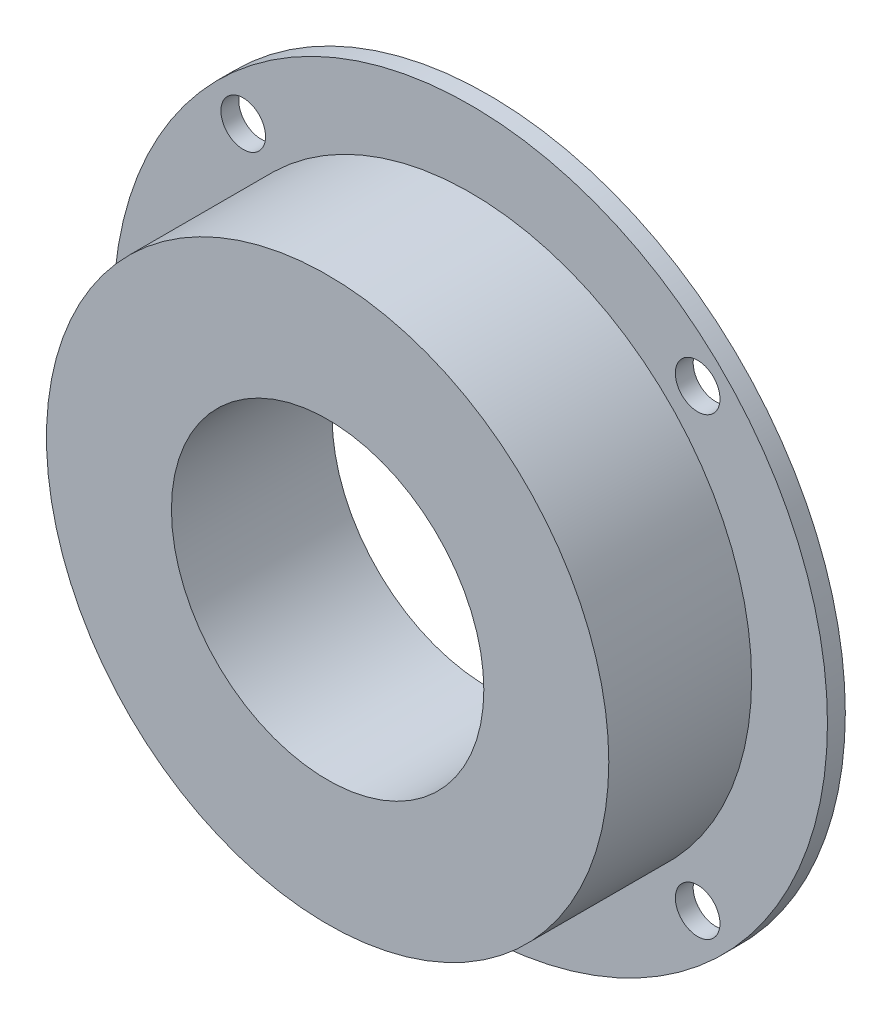
ISO-10303-21;
HEADER;
FILE_DESCRIPTION(('STEP AP214'),'2;1');
FILE_NAME('part.step','',(''),(''),'','','');
FILE_SCHEMA(('AUTOMOTIVE_DESIGN { 1 0 10303 214 1 1 1 1 }'));
ENDSEC;
DATA;
#1=APPLICATION_CONTEXT('core data for automotive mechanical design processes');
#2=APPLICATION_PROTOCOL_DEFINITION('international standard','automotive_design',2000,#1);
#3=PRODUCT_CONTEXT('',#1,'mechanical');
#4=PRODUCT('Part','Part','',(#3));
#5=PRODUCT_RELATED_PRODUCT_CATEGORY('part','',(#4));
#6=PRODUCT_DEFINITION_FORMATION('','',#4);
#7=PRODUCT_DEFINITION_CONTEXT('part definition',#1,'design');
#8=PRODUCT_DEFINITION('design','',#6,#7);
#9=PRODUCT_DEFINITION_SHAPE('','',#8);
#10=(LENGTH_UNIT() NAMED_UNIT(*) SI_UNIT(.MILLI.,.METRE.));
#11=(NAMED_UNIT(*) PLANE_ANGLE_UNIT() SI_UNIT($,.RADIAN.));
#12=(NAMED_UNIT(*) SI_UNIT($,.STERADIAN.) SOLID_ANGLE_UNIT());
#13=UNCERTAINTY_MEASURE_WITH_UNIT(LENGTH_MEASURE(1.E-05),#10,'distance_accuracy_value','');
#14=(GEOMETRIC_REPRESENTATION_CONTEXT(3) GLOBAL_UNCERTAINTY_ASSIGNED_CONTEXT((#13)) GLOBAL_UNIT_ASSIGNED_CONTEXT((#10,
#11,#12)) REPRESENTATION_CONTEXT('',''));
#15=CARTESIAN_POINT('',(0.,0.,0.));
#16=DIRECTION('',(0.,0.,1.));
#17=DIRECTION('',(1.,0.,0.));
#18=AXIS2_PLACEMENT_3D('',#15,#16,#17);
#19=CARTESIAN_POINT('',(0.,0.,2.));
#20=DIRECTION('',(0.,0.,1.));
#21=DIRECTION('',(1.,0.,0.));
#22=AXIS2_PLACEMENT_3D('',#19,#20,#21);
#23=PLANE('',#22);
#24=CARTESIAN_POINT('',(-25.4558441227158,25.4558441227143,2.));
#25=DIRECTION('',(0.,0.,1.));
#26=DIRECTION('',(1.,0.,0.));
#27=AXIS2_PLACEMENT_3D('',#24,#25,#26);
#28=CIRCLE('',#27,2.50000000000151);
#29=CARTESIAN_POINT('',(-22.9558441227143,25.4558441227143,2.));
#30=VERTEX_POINT('',#29);
#31=EDGE_CURVE('E71',#30,#30,#28,.T.);
#32=ORIENTED_EDGE('',*,*,#31,.F.);
#33=EDGE_LOOP('',(#32));
#34=FACE_BOUND('',#33,.T.);
#35=CARTESIAN_POINT('',(-25.4558441227143,-25.4558441227172,2.));
#36=DIRECTION('',(0.,0.,1.));
#37=DIRECTION('',(1.,0.,0.));
#38=AXIS2_PLACEMENT_3D('',#35,#36,#37);
#39=CIRCLE('',#38,2.50000000000104);
#40=CARTESIAN_POINT('',(-22.9558441227132,-25.4558441227172,2.));
#41=VERTEX_POINT('',#40);
#42=EDGE_CURVE('E77',#41,#41,#39,.T.);
#43=ORIENTED_EDGE('',*,*,#42,.F.);
#44=EDGE_LOOP('',(#43));
#45=FACE_BOUND('',#44,.T.);
#46=CARTESIAN_POINT('',(25.4558441227171,-25.4558441227157,2.));
#47=DIRECTION('',(0.,0.,1.));
#48=DIRECTION('',(1.,0.,0.));
#49=AXIS2_PLACEMENT_3D('',#46,#47,#48);
#50=CIRCLE('',#49,2.49999999999964);
#51=CARTESIAN_POINT('',(27.9558441227168,-25.4558441227157,2.));
#52=VERTEX_POINT('',#51);
#53=EDGE_CURVE('E83',#52,#52,#50,.T.);
#54=ORIENTED_EDGE('',*,*,#53,.F.);
#55=EDGE_LOOP('',(#54));
#56=FACE_BOUND('',#55,.T.);
#57=CARTESIAN_POINT('',(25.4558441227157,25.4558441227158,2.));
#58=DIRECTION('',(0.,0.,1.));
#59=DIRECTION('',(1.,0.,0.));
#60=AXIS2_PLACEMENT_3D('',#57,#58,#59);
#61=CIRCLE('',#60,2.5);
#62=CARTESIAN_POINT('',(27.9558441227157,25.4558441227158,2.));
#63=VERTEX_POINT('',#62);
#64=EDGE_CURVE('E65',#63,#63,#61,.T.);
#65=ORIENTED_EDGE('',*,*,#64,.F.);
#66=EDGE_LOOP('',(#65));
#67=FACE_BOUND('',#66,.T.);
#68=CARTESIAN_POINT('',(0.,0.,2.));
#69=DIRECTION('',(0.,0.,1.));
#70=DIRECTION('',(1.,0.,0.));
#71=AXIS2_PLACEMENT_3D('',#68,#69,#70);
#72=CIRCLE('',#71,31.5);
#73=CARTESIAN_POINT('',(31.5,0.,2.));
#74=VERTEX_POINT('',#73);
#75=EDGE_CURVE('E10',#74,#74,#72,.T.);
#76=ORIENTED_EDGE('',*,*,#75,.F.);
#77=EDGE_LOOP('',(#76));
#78=FACE_BOUND('',#77,.T.);
#79=CARTESIAN_POINT('',(0.,0.,2.));
#80=DIRECTION('',(0.,0.,1.));
#81=DIRECTION('',(1.,0.,0.));
#82=AXIS2_PLACEMENT_3D('',#79,#80,#81);
#83=CIRCLE('',#82,40.);
#84=CARTESIAN_POINT('',(40.,0.,2.));
#85=VERTEX_POINT('',#84);
#86=EDGE_CURVE('E42',#85,#85,#83,.T.);
#87=ORIENTED_EDGE('',*,*,#86,.T.);
#88=EDGE_LOOP('',(#87));
#89=FACE_BOUND('',#88,.T.);
#90=ADVANCED_FACE('F34',(#34,#45,#56,#67,#78,#89),#23,.T.);
#91=CARTESIAN_POINT('',(0.,0.,0.));
#92=DIRECTION('',(0.,0.,1.));
#93=DIRECTION('',(1.,0.,0.));
#94=AXIS2_PLACEMENT_3D('',#91,#92,#93);
#95=PLANE('',#94);
#96=CARTESIAN_POINT('',(-25.4558441227158,25.4558441227143,0.));
#97=DIRECTION('',(0.,0.,1.));
#98=DIRECTION('',(1.,0.,0.));
#99=AXIS2_PLACEMENT_3D('',#96,#97,#98);
#100=CIRCLE('',#99,2.50000000000151);
#101=CARTESIAN_POINT('',(-22.9558441227143,25.4558441227143,0.));
#102=VERTEX_POINT('',#101);
#103=EDGE_CURVE('E74',#102,#102,#100,.T.);
#104=ORIENTED_EDGE('',*,*,#103,.T.);
#105=EDGE_LOOP('',(#104));
#106=FACE_BOUND('',#105,.T.);
#107=CARTESIAN_POINT('',(-25.4558441227143,-25.4558441227172,0.));
#108=DIRECTION('',(0.,0.,1.));
#109=DIRECTION('',(1.,0.,0.));
#110=AXIS2_PLACEMENT_3D('',#107,#108,#109);
#111=CIRCLE('',#110,2.50000000000104);
#112=CARTESIAN_POINT('',(-22.9558441227132,-25.4558441227172,0.));
#113=VERTEX_POINT('',#112);
#114=EDGE_CURVE('E80',#113,#113,#111,.T.);
#115=ORIENTED_EDGE('',*,*,#114,.T.);
#116=EDGE_LOOP('',(#115));
#117=FACE_BOUND('',#116,.T.);
#118=CARTESIAN_POINT('',(25.4558441227171,-25.4558441227157,0.));
#119=DIRECTION('',(0.,0.,1.));
#120=DIRECTION('',(1.,0.,0.));
#121=AXIS2_PLACEMENT_3D('',#118,#119,#120);
#122=CIRCLE('',#121,2.49999999999964);
#123=CARTESIAN_POINT('',(27.9558441227168,-25.4558441227157,0.));
#124=VERTEX_POINT('',#123);
#125=EDGE_CURVE('E69',#124,#124,#122,.T.);
#126=ORIENTED_EDGE('',*,*,#125,.T.);
#127=EDGE_LOOP('',(#126));
#128=FACE_BOUND('',#127,.T.);
#129=CARTESIAN_POINT('',(25.4558441227157,25.4558441227158,0.));
#130=DIRECTION('',(0.,0.,1.));
#131=DIRECTION('',(1.,0.,0.));
#132=AXIS2_PLACEMENT_3D('',#129,#130,#131);
#133=CIRCLE('',#132,2.5);
#134=CARTESIAN_POINT('',(27.9558441227157,25.4558441227158,0.));
#135=VERTEX_POINT('',#134);
#136=EDGE_CURVE('E61',#135,#135,#133,.T.);
#137=ORIENTED_EDGE('',*,*,#136,.T.);
#138=EDGE_LOOP('',(#137));
#139=FACE_BOUND('',#138,.T.);
#140=CARTESIAN_POINT('',(0.,0.,0.));
#141=DIRECTION('',(0.,0.,1.));
#142=DIRECTION('',(1.,0.,0.));
#143=AXIS2_PLACEMENT_3D('',#140,#141,#142);
#144=CIRCLE('',#143,40.);
#145=CARTESIAN_POINT('',(40.,0.,0.));
#146=VERTEX_POINT('',#145);
#147=EDGE_CURVE('E38',#146,#146,#144,.T.);
#148=ORIENTED_EDGE('',*,*,#147,.F.);
#149=EDGE_LOOP('',(#148));
#150=FACE_BOUND('',#149,.T.);
#151=CARTESIAN_POINT('',(0.,0.,0.));
#152=DIRECTION('',(0.,0.,1.));
#153=DIRECTION('',(1.,0.,0.));
#154=AXIS2_PLACEMENT_3D('',#151,#152,#153);
#155=CIRCLE('',#154,17.5);
#156=CARTESIAN_POINT('',(17.5,0.,0.));
#157=VERTEX_POINT('',#156);
#158=EDGE_CURVE('E51',#157,#157,#155,.T.);
#159=ORIENTED_EDGE('',*,*,#158,.T.);
#160=EDGE_LOOP('',(#159));
#161=FACE_BOUND('',#160,.T.);
#162=ADVANCED_FACE('F89',(#106,#117,#128,#139,#150,#161),#95,.F.);
#163=CARTESIAN_POINT('',(0.,0.,2.));
#164=DIRECTION('',(0.,0.,-1.));
#165=DIRECTION('',(-1.,0.,0.));
#166=AXIS2_PLACEMENT_3D('',#163,#164,#165);
#167=CYLINDRICAL_SURFACE('',#166,40.);
#168=ORIENTED_EDGE('',*,*,#86,.F.);
#169=EDGE_LOOP('',(#168));
#170=FACE_BOUND('',#169,.T.);
#171=ORIENTED_EDGE('',*,*,#147,.T.);
#172=EDGE_LOOP('',(#171));
#173=FACE_BOUND('',#172,.T.);
#174=ADVANCED_FACE('F36',(#170,#173),#167,.T.);
#175=CARTESIAN_POINT('',(0.,0.,2.));
#176=DIRECTION('',(0.,0.,-1.));
#177=DIRECTION('',(-1.,0.,0.));
#178=AXIS2_PLACEMENT_3D('',#175,#176,#177);
#179=CYLINDRICAL_SURFACE('',#178,17.5);
#180=ORIENTED_EDGE('',*,*,#158,.F.);
#181=EDGE_LOOP('',(#180));
#182=FACE_BOUND('',#181,.T.);
#183=CARTESIAN_POINT('',(0.,0.,18.));
#184=DIRECTION('',(0.,0.,1.));
#185=DIRECTION('',(1.,0.,0.));
#186=AXIS2_PLACEMENT_3D('',#183,#184,#185);
#187=CIRCLE('',#186,17.5);
#188=CARTESIAN_POINT('',(17.5,0.,18.));
#189=VERTEX_POINT('',#188);
#190=EDGE_CURVE('E57',#189,#189,#187,.T.);
#191=ORIENTED_EDGE('',*,*,#190,.T.);
#192=EDGE_LOOP('',(#191));
#193=FACE_BOUND('',#192,.T.);
#194=ADVANCED_FACE('F111',(#182,#193),#179,.F.);
#195=CARTESIAN_POINT('',(0.,0.,18.));
#196=DIRECTION('',(0.,0.,1.));
#197=DIRECTION('',(1.,0.,0.));
#198=AXIS2_PLACEMENT_3D('',#195,#196,#197);
#199=PLANE('',#198);
#200=CARTESIAN_POINT('',(0.,0.,18.));
#201=DIRECTION('',(0.,0.,1.));
#202=DIRECTION('',(1.,0.,0.));
#203=AXIS2_PLACEMENT_3D('',#200,#201,#202);
#204=CIRCLE('',#203,31.5);
#205=CARTESIAN_POINT('',(31.5,0.,18.));
#206=VERTEX_POINT('',#205);
#207=EDGE_CURVE('E49',#206,#206,#204,.T.);
#208=ORIENTED_EDGE('',*,*,#207,.T.);
#209=EDGE_LOOP('',(#208));
#210=FACE_BOUND('',#209,.T.);
#211=ORIENTED_EDGE('',*,*,#190,.F.);
#212=EDGE_LOOP('',(#211));
#213=FACE_BOUND('',#212,.T.);
#214=ADVANCED_FACE('F122',(#210,#213),#199,.T.);
#215=CARTESIAN_POINT('',(0.,0.,18.));
#216=DIRECTION('',(0.,0.,-1.));
#217=DIRECTION('',(-1.,0.,0.));
#218=AXIS2_PLACEMENT_3D('',#215,#216,#217);
#219=CYLINDRICAL_SURFACE('',#218,31.5);
#220=ORIENTED_EDGE('',*,*,#207,.F.);
#221=EDGE_LOOP('',(#220));
#222=FACE_BOUND('',#221,.T.);
#223=ORIENTED_EDGE('',*,*,#75,.T.);
#224=EDGE_LOOP('',(#223));
#225=FACE_BOUND('',#224,.T.);
#226=ADVANCED_FACE('F124',(#222,#225),#219,.T.);
#227=CARTESIAN_POINT('',(25.4558441227157,25.4558441227158,0.));
#228=DIRECTION('',(0.,0.,1.));
#229=DIRECTION('',(1.,0.,0.));
#230=AXIS2_PLACEMENT_3D('',#227,#228,#229);
#231=CYLINDRICAL_SURFACE('',#230,2.5);
#232=ORIENTED_EDGE('',*,*,#136,.F.);
#233=EDGE_LOOP('',(#232));
#234=FACE_BOUND('',#233,.T.);
#235=ORIENTED_EDGE('',*,*,#64,.T.);
#236=EDGE_LOOP('',(#235));
#237=FACE_BOUND('',#236,.T.);
#238=ADVANCED_FACE('F96',(#234,#237),#231,.F.);
#239=CARTESIAN_POINT('',(25.4558441227171,-25.4558441227157,0.));
#240=DIRECTION('',(0.,0.,1.));
#241=DIRECTION('',(1.,0.,0.));
#242=AXIS2_PLACEMENT_3D('',#239,#240,#241);
#243=CYLINDRICAL_SURFACE('',#242,2.49999999999964);
#244=ORIENTED_EDGE('',*,*,#125,.F.);
#245=EDGE_LOOP('',(#244));
#246=FACE_BOUND('',#245,.T.);
#247=ORIENTED_EDGE('',*,*,#53,.T.);
#248=EDGE_LOOP('',(#247));
#249=FACE_BOUND('',#248,.T.);
#250=ADVANCED_FACE('F92',(#246,#249),#243,.F.);
#251=CARTESIAN_POINT('',(-25.4558441227143,-25.4558441227172,0.));
#252=DIRECTION('',(0.,0.,1.));
#253=DIRECTION('',(1.,0.,0.));
#254=AXIS2_PLACEMENT_3D('',#251,#252,#253);
#255=CYLINDRICAL_SURFACE('',#254,2.50000000000104);
#256=ORIENTED_EDGE('',*,*,#114,.F.);
#257=EDGE_LOOP('',(#256));
#258=FACE_BOUND('',#257,.T.);
#259=ORIENTED_EDGE('',*,*,#42,.T.);
#260=EDGE_LOOP('',(#259));
#261=FACE_BOUND('',#260,.T.);
#262=ADVANCED_FACE('F95',(#258,#261),#255,.F.);
#263=CARTESIAN_POINT('',(-25.4558441227158,25.4558441227143,0.));
#264=DIRECTION('',(0.,0.,1.));
#265=DIRECTION('',(1.,0.,0.));
#266=AXIS2_PLACEMENT_3D('',#263,#264,#265);
#267=CYLINDRICAL_SURFACE('',#266,2.50000000000151);
#268=ORIENTED_EDGE('',*,*,#103,.F.);
#269=EDGE_LOOP('',(#268));
#270=FACE_BOUND('',#269,.T.);
#271=ORIENTED_EDGE('',*,*,#31,.T.);
#272=EDGE_LOOP('',(#271));
#273=FACE_BOUND('',#272,.T.);
#274=ADVANCED_FACE('F133',(#270,#273),#267,.F.);
#275=CLOSED_SHELL('',(#90,#162,#174,#194,#214,#226,#238,#250,#262,#274));
#276=MANIFOLD_SOLID_BREP('B2',#275);
#277=ADVANCED_BREP_SHAPE_REPRESENTATION('',(#18,#276),#14);
#278=SHAPE_DEFINITION_REPRESENTATION(#9,#277);
ENDSEC;
END-ISO-10303-21;
